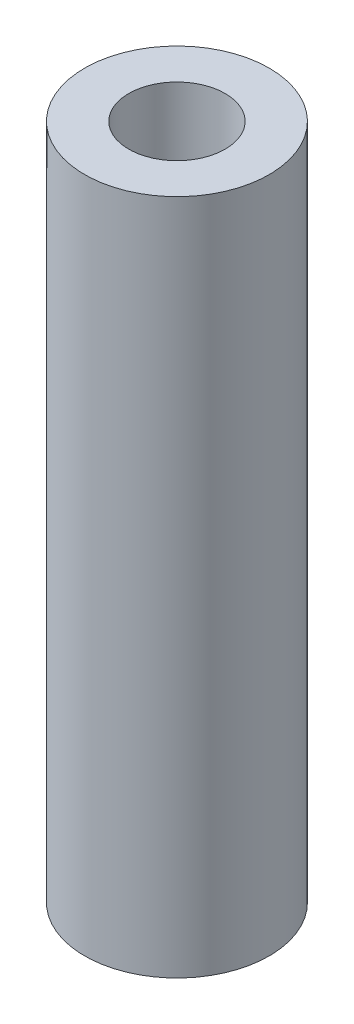
ISO-10303-21;
HEADER;
FILE_DESCRIPTION(('STEP AP214'),'2;1');
FILE_NAME('part.step','',(''),(''),'','','');
FILE_SCHEMA(('AUTOMOTIVE_DESIGN { 1 0 10303 214 1 1 1 1 }'));
ENDSEC;
DATA;
#1=APPLICATION_CONTEXT('core data for automotive mechanical design processes');
#2=APPLICATION_PROTOCOL_DEFINITION('international standard','automotive_design',2000,#1);
#3=PRODUCT_CONTEXT('',#1,'mechanical');
#4=PRODUCT('Part','Part','',(#3));
#5=PRODUCT_RELATED_PRODUCT_CATEGORY('part','',(#4));
#6=PRODUCT_DEFINITION_FORMATION('','',#4);
#7=PRODUCT_DEFINITION_CONTEXT('part definition',#1,'design');
#8=PRODUCT_DEFINITION('design','',#6,#7);
#9=PRODUCT_DEFINITION_SHAPE('','',#8);
#10=(LENGTH_UNIT() NAMED_UNIT(*) SI_UNIT(.MILLI.,.METRE.));
#11=(NAMED_UNIT(*) PLANE_ANGLE_UNIT() SI_UNIT($,.RADIAN.));
#12=(NAMED_UNIT(*) SI_UNIT($,.STERADIAN.) SOLID_ANGLE_UNIT());
#13=UNCERTAINTY_MEASURE_WITH_UNIT(LENGTH_MEASURE(1.E-05),#10,'distance_accuracy_value','');
#14=(GEOMETRIC_REPRESENTATION_CONTEXT(3) GLOBAL_UNCERTAINTY_ASSIGNED_CONTEXT((#13)) GLOBAL_UNIT_ASSIGNED_CONTEXT((#10,
#11,#12)) REPRESENTATION_CONTEXT('',''));
#15=CARTESIAN_POINT('',(0.,0.,0.));
#16=DIRECTION('',(0.,0.,1.));
#17=DIRECTION('',(1.,0.,0.));
#18=AXIS2_PLACEMENT_3D('',#15,#16,#17);
#19=CARTESIAN_POINT('',(647.7,-85.725,1092.2));
#20=DIRECTION('',(0.,1.,0.));
#21=DIRECTION('',(0.,0.,1.));
#22=AXIS2_PLACEMENT_3D('',#19,#20,#21);
#23=CYLINDRICAL_SURFACE('',#22,2.4892);
#24=CARTESIAN_POINT('',(647.7,-85.725,1092.2));
#25=DIRECTION('',(0.,1.,0.));
#26=DIRECTION('',(0.,0.,-1.));
#27=AXIS2_PLACEMENT_3D('',#24,#25,#26);
#28=CIRCLE('',#27,2.4892);
#29=CARTESIAN_POINT('',(647.7,-85.725,1089.7108));
#30=VERTEX_POINT('',#29);
#31=EDGE_CURVE('E22',#30,#30,#28,.T.);
#32=ORIENTED_EDGE('',*,*,#31,.F.);
#33=EDGE_LOOP('',(#32));
#34=FACE_BOUND('',#33,.T.);
#35=CARTESIAN_POINT('',(647.7,-50.8,1092.2));
#36=DIRECTION('',(0.,1.,0.));
#37=DIRECTION('',(0.,0.,-1.));
#38=AXIS2_PLACEMENT_3D('',#35,#36,#37);
#39=CIRCLE('',#38,2.4892);
#40=CARTESIAN_POINT('',(647.7,-50.8,1089.7108));
#41=VERTEX_POINT('',#40);
#42=EDGE_CURVE('E28',#41,#41,#39,.T.);
#43=ORIENTED_EDGE('',*,*,#42,.T.);
#44=EDGE_LOOP('',(#43));
#45=FACE_BOUND('',#44,.T.);
#46=ADVANCED_FACE('F15',(#34,#45),#23,.F.);
#47=CARTESIAN_POINT('',(647.7,-85.725,1092.2));
#48=DIRECTION('',(0.,1.,0.));
#49=DIRECTION('',(0.,0.,1.));
#50=AXIS2_PLACEMENT_3D('',#47,#48,#49);
#51=CYLINDRICAL_SURFACE('',#50,4.7625);
#52=CARTESIAN_POINT('',(647.7,-85.725,1092.2));
#53=DIRECTION('',(0.,1.,0.));
#54=DIRECTION('',(0.,0.,-1.));
#55=AXIS2_PLACEMENT_3D('',#52,#53,#54);
#56=CIRCLE('',#55,4.7625);
#57=CARTESIAN_POINT('',(647.7,-85.725,1087.4375));
#58=VERTEX_POINT('',#57);
#59=EDGE_CURVE('E10',#58,#58,#56,.T.);
#60=ORIENTED_EDGE('',*,*,#59,.T.);
#61=EDGE_LOOP('',(#60));
#62=FACE_BOUND('',#61,.T.);
#63=CARTESIAN_POINT('',(647.7,-50.8,1092.2));
#64=DIRECTION('',(0.,1.,0.));
#65=DIRECTION('',(0.,0.,-1.));
#66=AXIS2_PLACEMENT_3D('',#63,#64,#65);
#67=CIRCLE('',#66,4.7625);
#68=CARTESIAN_POINT('',(647.7,-50.8,1087.4375));
#69=VERTEX_POINT('',#68);
#70=EDGE_CURVE('E18',#69,#69,#67,.T.);
#71=ORIENTED_EDGE('',*,*,#70,.F.);
#72=EDGE_LOOP('',(#71));
#73=FACE_BOUND('',#72,.T.);
#74=ADVANCED_FACE('F37',(#62,#73),#51,.T.);
#75=CARTESIAN_POINT('',(647.7,-85.725,596.9));
#76=DIRECTION('',(0.,-1.,0.));
#77=DIRECTION('',(-1.,0.,0.));
#78=AXIS2_PLACEMENT_3D('',#75,#76,#77);
#79=PLANE('',#78);
#80=ORIENTED_EDGE('',*,*,#31,.T.);
#81=EDGE_LOOP('',(#80));
#82=FACE_BOUND('',#81,.T.);
#83=ORIENTED_EDGE('',*,*,#59,.F.);
#84=EDGE_LOOP('',(#83));
#85=FACE_BOUND('',#84,.T.);
#86=ADVANCED_FACE('F39',(#82,#85),#79,.T.);
#87=CARTESIAN_POINT('',(647.7,-50.8,596.9));
#88=DIRECTION('',(0.,-1.,0.));
#89=DIRECTION('',(-1.,0.,0.));
#90=AXIS2_PLACEMENT_3D('',#87,#88,#89);
#91=PLANE('',#90);
#92=ORIENTED_EDGE('',*,*,#42,.F.);
#93=EDGE_LOOP('',(#92));
#94=FACE_BOUND('',#93,.T.);
#95=ORIENTED_EDGE('',*,*,#70,.T.);
#96=EDGE_LOOP('',(#95));
#97=FACE_BOUND('',#96,.T.);
#98=ADVANCED_FACE('F35',(#94,#97),#91,.F.);
#99=CLOSED_SHELL('',(#46,#74,#86,#98));
#100=MANIFOLD_SOLID_BREP('B1',#99);
#101=ADVANCED_BREP_SHAPE_REPRESENTATION('',(#18,#100),#14);
#102=SHAPE_DEFINITION_REPRESENTATION(#9,#101);
ENDSEC;
END-ISO-10303-21;
